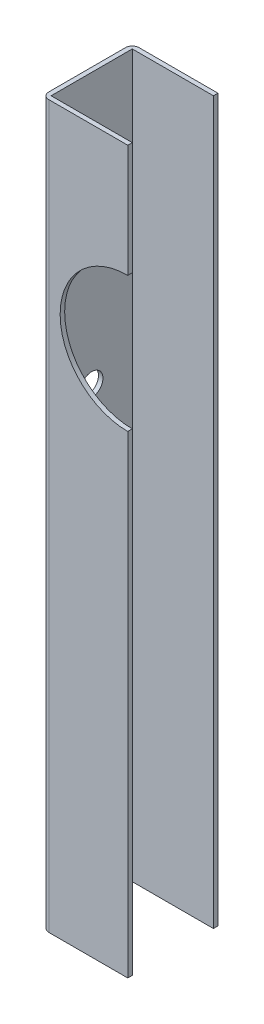
ISO-10303-21;
HEADER;
FILE_DESCRIPTION(('STEP AP214'),'2;1');
FILE_NAME('part.step','',(''),(''),'','','');
FILE_SCHEMA(('AUTOMOTIVE_DESIGN { 1 0 10303 214 1 1 1 1 }'));
ENDSEC;
DATA;
#1=APPLICATION_CONTEXT('core data for automotive mechanical design processes');
#2=APPLICATION_PROTOCOL_DEFINITION('international standard','automotive_design',2000,#1);
#3=PRODUCT_CONTEXT('',#1,'mechanical');
#4=PRODUCT('Part','Part','',(#3));
#5=PRODUCT_RELATED_PRODUCT_CATEGORY('part','',(#4));
#6=PRODUCT_DEFINITION_FORMATION('','',#4);
#7=PRODUCT_DEFINITION_CONTEXT('part definition',#1,'design');
#8=PRODUCT_DEFINITION('design','',#6,#7);
#9=PRODUCT_DEFINITION_SHAPE('','',#8);
#10=(LENGTH_UNIT() NAMED_UNIT(*) SI_UNIT(.MILLI.,.METRE.));
#11=(NAMED_UNIT(*) PLANE_ANGLE_UNIT() SI_UNIT($,.RADIAN.));
#12=(NAMED_UNIT(*) SI_UNIT($,.STERADIAN.) SOLID_ANGLE_UNIT());
#13=UNCERTAINTY_MEASURE_WITH_UNIT(LENGTH_MEASURE(1.E-05),#10,'distance_accuracy_value','');
#14=(GEOMETRIC_REPRESENTATION_CONTEXT(3) GLOBAL_UNCERTAINTY_ASSIGNED_CONTEXT((#13)) GLOBAL_UNIT_ASSIGNED_CONTEXT((#10,
#11,#12)) REPRESENTATION_CONTEXT('',''));
#15=CARTESIAN_POINT('',(0.,0.,0.));
#16=DIRECTION('',(0.,0.,1.));
#17=DIRECTION('',(1.,0.,0.));
#18=AXIS2_PLACEMENT_3D('',#15,#16,#17);
#19=CARTESIAN_POINT('',(11.43,203.2,11.43));
#20=DIRECTION('',(-1.,0.,0.));
#21=DIRECTION('',(0.,0.,1.));
#22=AXIS2_PLACEMENT_3D('',#19,#20,#21);
#23=PLANE('',#22);
#24=DIRECTION('',(0.,0.,-1.));
#25=VECTOR('',#24,1.);
#26=CARTESIAN_POINT('',(11.43,133.35,270.447626383348));
#27=LINE('',#26,#25);
#28=CARTESIAN_POINT('',(11.43,133.35,12.7));
#29=VERTEX_POINT('',#28);
#30=CARTESIAN_POINT('',(11.43,133.35,11.43));
#31=VERTEX_POINT('',#30);
#32=EDGE_CURVE('E149',#29,#31,#27,.T.);
#33=ORIENTED_EDGE('',*,*,#32,.F.);
#34=DIRECTION('',(0.,-1.,0.));
#35=VECTOR('',#34,1.);
#36=CARTESIAN_POINT('',(11.43,203.2,12.7));
#37=LINE('',#36,#35);
#38=CARTESIAN_POINT('',(11.43,0.,12.7));
#39=VERTEX_POINT('',#38);
#40=EDGE_CURVE('E157',#29,#39,#37,.T.);
#41=ORIENTED_EDGE('',*,*,#40,.T.);
#42=DIRECTION('',(0.,0.,-1.));
#43=VECTOR('',#42,1.);
#44=CARTESIAN_POINT('',(11.43,0.,12.7));
#45=LINE('',#44,#43);
#46=CARTESIAN_POINT('',(11.43,0.,11.43));
#47=VERTEX_POINT('',#46);
#48=EDGE_CURVE('E175',#39,#47,#45,.T.);
#49=ORIENTED_EDGE('',*,*,#48,.T.);
#50=DIRECTION('',(0.,-1.,0.));
#51=VECTOR('',#50,1.);
#52=CARTESIAN_POINT('',(11.43,203.2,11.43));
#53=LINE('',#52,#51);
#54=EDGE_CURVE('E193',#31,#47,#53,.T.);
#55=ORIENTED_EDGE('',*,*,#54,.F.);
#56=EDGE_LOOP('',(#33,#41,#49,#55));
#57=FACE_BOUND('',#56,.T.);
#58=ADVANCED_FACE('F45',(#57),#23,.F.);
#59=CARTESIAN_POINT('',(-12.7,203.2,12.7));
#60=DIRECTION('',(0.,0.,-1.));
#61=DIRECTION('',(-1.,0.,0.));
#62=AXIS2_PLACEMENT_3D('',#59,#60,#61);
#63=PLANE('',#62);
#64=DIRECTION('',(1.,0.,0.));
#65=VECTOR('',#64,1.);
#66=CARTESIAN_POINT('',(-12.7,203.2,12.7));
#67=LINE('',#66,#65);
#68=CARTESIAN_POINT('',(-10.795,203.2,12.7));
#69=VERTEX_POINT('',#68);
#70=CARTESIAN_POINT('',(11.43,203.2,12.7));
#71=VERTEX_POINT('',#70);
#72=EDGE_CURVE('E221',#69,#71,#67,.T.);
#73=ORIENTED_EDGE('',*,*,#72,.F.);
#74=DIRECTION('',(0.,-1.,0.));
#75=VECTOR('',#74,1.);
#76=CARTESIAN_POINT('',(-10.795,203.2,12.7));
#77=LINE('',#76,#75);
#78=CARTESIAN_POINT('',(-10.795,0.,12.7));
#79=VERTEX_POINT('',#78);
#80=EDGE_CURVE('E11',#69,#79,#77,.T.);
#81=ORIENTED_EDGE('',*,*,#80,.T.);
#82=DIRECTION('',(1.,0.,0.));
#83=VECTOR('',#82,1.);
#84=CARTESIAN_POINT('',(-12.7,0.,12.7));
#85=LINE('',#84,#83);
#86=EDGE_CURVE('E218',#79,#39,#85,.T.);
#87=ORIENTED_EDGE('',*,*,#86,.T.);
#88=ORIENTED_EDGE('',*,*,#40,.F.);
#89=CARTESIAN_POINT('',(11.43,152.4,12.7));
#90=DIRECTION('',(0.,0.,-1.));
#91=DIRECTION('',(-1.,0.,0.));
#92=AXIS2_PLACEMENT_3D('',#89,#90,#91);
#93=CIRCLE('',#92,19.05);
#94=CARTESIAN_POINT('',(11.43,171.45,12.7));
#95=VERTEX_POINT('',#94);
#96=EDGE_CURVE('E140',#29,#95,#93,.T.);
#97=ORIENTED_EDGE('',*,*,#96,.T.);
#98=EDGE_CURVE('E155',#71,#95,#37,.T.);
#99=ORIENTED_EDGE('',*,*,#98,.F.);
#100=EDGE_LOOP('',(#73,#81,#87,#88,#97,#99));
#101=FACE_BOUND('',#100,.T.);
#102=ADVANCED_FACE('F154',(#101),#63,.F.);
#103=CARTESIAN_POINT('',(0.,203.2,0.));
#104=DIRECTION('',(0.,-1.,0.));
#105=DIRECTION('',(0.,0.,-1.));
#106=AXIS2_PLACEMENT_3D('',#103,#104,#105);
#107=PLANE('',#106);
#108=DIRECTION('',(-1.,0.,0.));
#109=VECTOR('',#108,1.);
#110=CARTESIAN_POINT('',(-12.7,203.2,-12.7));
#111=LINE('',#110,#109);
#112=CARTESIAN_POINT('',(11.43,203.2,-12.7));
#113=VERTEX_POINT('',#112);
#114=CARTESIAN_POINT('',(-10.795,203.2,-12.7));
#115=VERTEX_POINT('',#114);
#116=EDGE_CURVE('E214',#113,#115,#111,.T.);
#117=ORIENTED_EDGE('',*,*,#116,.T.);
#118=CARTESIAN_POINT('',(-10.795,203.2,-10.795));
#119=DIRECTION('',(0.,-1.,0.));
#120=DIRECTION('',(0.,0.,-1.));
#121=AXIS2_PLACEMENT_3D('',#118,#119,#120);
#122=CIRCLE('',#121,1.905);
#123=CARTESIAN_POINT('',(-12.7,203.2,-10.795));
#124=VERTEX_POINT('',#123);
#125=EDGE_CURVE('E54',#115,#124,#122,.F.);
#126=ORIENTED_EDGE('',*,*,#125,.T.);
#127=DIRECTION('',(0.,0.,1.));
#128=VECTOR('',#127,1.);
#129=CARTESIAN_POINT('',(-12.7,203.2,12.7));
#130=LINE('',#129,#128);
#131=CARTESIAN_POINT('',(-12.7,203.2,10.795));
#132=VERTEX_POINT('',#131);
#133=EDGE_CURVE('E217',#124,#132,#130,.T.);
#134=ORIENTED_EDGE('',*,*,#133,.T.);
#135=CARTESIAN_POINT('',(-10.795,203.2,10.795));
#136=DIRECTION('',(0.,-1.,0.));
#137=DIRECTION('',(0.,0.,-1.));
#138=AXIS2_PLACEMENT_3D('',#135,#136,#137);
#139=CIRCLE('',#138,1.905);
#140=EDGE_CURVE('E61',#132,#69,#139,.F.);
#141=ORIENTED_EDGE('',*,*,#140,.T.);
#142=ORIENTED_EDGE('',*,*,#72,.T.);
#143=DIRECTION('',(0.,0.,1.));
#144=VECTOR('',#143,1.);
#145=CARTESIAN_POINT('',(11.43,203.2,12.7));
#146=LINE('',#145,#144);
#147=CARTESIAN_POINT('',(11.43,203.2,11.43));
#148=VERTEX_POINT('',#147);
#149=EDGE_CURVE('E163',#148,#71,#146,.T.);
#150=ORIENTED_EDGE('',*,*,#149,.F.);
#151=DIRECTION('',(1.,0.,0.));
#152=VECTOR('',#151,1.);
#153=CARTESIAN_POINT('',(-11.43,203.2,11.43));
#154=LINE('',#153,#152);
#155=CARTESIAN_POINT('',(-11.43,203.2,11.43));
#156=VERTEX_POINT('',#155);
#157=EDGE_CURVE('E190',#156,#148,#154,.T.);
#158=ORIENTED_EDGE('',*,*,#157,.F.);
#159=DIRECTION('',(0.,0.,1.));
#160=VECTOR('',#159,1.);
#161=CARTESIAN_POINT('',(-11.43,203.2,11.43));
#162=LINE('',#161,#160);
#163=CARTESIAN_POINT('',(-11.43,203.2,-11.43));
#164=VERTEX_POINT('',#163);
#165=EDGE_CURVE('E185',#164,#156,#162,.T.);
#166=ORIENTED_EDGE('',*,*,#165,.F.);
#167=DIRECTION('',(-1.,0.,0.));
#168=VECTOR('',#167,1.);
#169=CARTESIAN_POINT('',(-11.43,203.2,-11.43));
#170=LINE('',#169,#168);
#171=CARTESIAN_POINT('',(11.43,203.2,-11.43));
#172=VERTEX_POINT('',#171);
#173=EDGE_CURVE('E182',#172,#164,#170,.T.);
#174=ORIENTED_EDGE('',*,*,#173,.F.);
#175=EDGE_CURVE('E172',#113,#172,#146,.T.);
#176=ORIENTED_EDGE('',*,*,#175,.F.);
#177=EDGE_LOOP('',(#117,#126,#134,#141,#142,#150,#158,#166,#174,#176));
#178=FACE_BOUND('',#177,.T.);
#179=ADVANCED_FACE('F253',(#178),#107,.F.);
#180=CARTESIAN_POINT('',(0.,0.,0.));
#181=DIRECTION('',(0.,-1.,0.));
#182=DIRECTION('',(0.,0.,-1.));
#183=AXIS2_PLACEMENT_3D('',#180,#181,#182);
#184=PLANE('',#183);
#185=DIRECTION('',(0.,0.,1.));
#186=VECTOR('',#185,1.);
#187=CARTESIAN_POINT('',(-12.7,0.,12.7));
#188=LINE('',#187,#186);
#189=CARTESIAN_POINT('',(-12.7,0.,-10.795));
#190=VERTEX_POINT('',#189);
#191=CARTESIAN_POINT('',(-12.7,0.,10.795));
#192=VERTEX_POINT('',#191);
#193=EDGE_CURVE('E226',#190,#192,#188,.T.);
#194=ORIENTED_EDGE('',*,*,#193,.F.);
#195=CARTESIAN_POINT('',(-10.795,0.,-10.795));
#196=DIRECTION('',(0.,-1.,0.));
#197=DIRECTION('',(0.,0.,-1.));
#198=AXIS2_PLACEMENT_3D('',#195,#196,#197);
#199=CIRCLE('',#198,1.905);
#200=CARTESIAN_POINT('',(-10.795,0.,-12.7));
#201=VERTEX_POINT('',#200);
#202=EDGE_CURVE('E244',#190,#201,#199,.T.);
#203=ORIENTED_EDGE('',*,*,#202,.T.);
#204=DIRECTION('',(-1.,0.,0.));
#205=VECTOR('',#204,1.);
#206=CARTESIAN_POINT('',(-12.7,0.,-12.7));
#207=LINE('',#206,#205);
#208=CARTESIAN_POINT('',(11.43,0.,-12.7));
#209=VERTEX_POINT('',#208);
#210=EDGE_CURVE('E213',#209,#201,#207,.T.);
#211=ORIENTED_EDGE('',*,*,#210,.F.);
#212=CARTESIAN_POINT('',(11.43,0.,-11.43));
#213=VERTEX_POINT('',#212);
#214=EDGE_CURVE('E271',#213,#209,#45,.T.);
#215=ORIENTED_EDGE('',*,*,#214,.F.);
#216=DIRECTION('',(-1.,0.,0.));
#217=VECTOR('',#216,1.);
#218=CARTESIAN_POINT('',(-11.43,0.,-11.43));
#219=LINE('',#218,#217);
#220=CARTESIAN_POINT('',(-11.43,0.,-11.43));
#221=VERTEX_POINT('',#220);
#222=EDGE_CURVE('E165',#213,#221,#219,.T.);
#223=ORIENTED_EDGE('',*,*,#222,.T.);
#224=DIRECTION('',(0.,0.,1.));
#225=VECTOR('',#224,1.);
#226=CARTESIAN_POINT('',(-11.43,0.,11.43));
#227=LINE('',#226,#225);
#228=CARTESIAN_POINT('',(-11.43,0.,11.43));
#229=VERTEX_POINT('',#228);
#230=EDGE_CURVE('E170',#221,#229,#227,.T.);
#231=ORIENTED_EDGE('',*,*,#230,.T.);
#232=DIRECTION('',(1.,0.,0.));
#233=VECTOR('',#232,1.);
#234=CARTESIAN_POINT('',(-11.43,0.,11.43));
#235=LINE('',#234,#233);
#236=EDGE_CURVE('E186',#229,#47,#235,.T.);
#237=ORIENTED_EDGE('',*,*,#236,.T.);
#238=ORIENTED_EDGE('',*,*,#48,.F.);
#239=ORIENTED_EDGE('',*,*,#86,.F.);
#240=CARTESIAN_POINT('',(-10.795,0.,10.795));
#241=DIRECTION('',(0.,-1.,0.));
#242=DIRECTION('',(0.,0.,-1.));
#243=AXIS2_PLACEMENT_3D('',#240,#241,#242);
#244=CIRCLE('',#243,1.905);
#245=EDGE_CURVE('E241',#79,#192,#244,.T.);
#246=ORIENTED_EDGE('',*,*,#245,.T.);
#247=EDGE_LOOP('',(#194,#203,#211,#215,#223,#231,#237,#238,#239,#246));
#248=FACE_BOUND('',#247,.T.);
#249=ADVANCED_FACE('F264',(#248),#184,.T.);
#250=CARTESIAN_POINT('',(-12.7,203.2,-12.7));
#251=DIRECTION('',(0.,0.,1.));
#252=DIRECTION('',(1.,0.,0.));
#253=AXIS2_PLACEMENT_3D('',#250,#251,#252);
#254=PLANE('',#253);
#255=ORIENTED_EDGE('',*,*,#210,.T.);
#256=DIRECTION('',(0.,-1.,0.));
#257=VECTOR('',#256,1.);
#258=CARTESIAN_POINT('',(-10.795,203.2,-12.7));
#259=LINE('',#258,#257);
#260=EDGE_CURVE('E69',#201,#115,#259,.F.);
#261=ORIENTED_EDGE('',*,*,#260,.T.);
#262=ORIENTED_EDGE('',*,*,#116,.F.);
#263=DIRECTION('',(0.,1.,0.));
#264=VECTOR('',#263,1.);
#265=CARTESIAN_POINT('',(11.43,203.2,-12.7));
#266=LINE('',#265,#264);
#267=EDGE_CURVE('E179',#209,#113,#266,.T.);
#268=ORIENTED_EDGE('',*,*,#267,.F.);
#269=EDGE_LOOP('',(#255,#261,#262,#268));
#270=FACE_BOUND('',#269,.T.);
#271=ADVANCED_FACE('F267',(#270),#254,.F.);
#272=CARTESIAN_POINT('',(-12.7,203.2,12.7));
#273=DIRECTION('',(1.,0.,0.));
#274=DIRECTION('',(0.,0.,-1.));
#275=AXIS2_PLACEMENT_3D('',#272,#273,#274);
#276=PLANE('',#275);
#277=CARTESIAN_POINT('',(-12.7,25.4,0.));
#278=DIRECTION('',(-1.,0.,0.));
#279=DIRECTION('',(0.,0.,1.));
#280=AXIS2_PLACEMENT_3D('',#277,#278,#279);
#281=CIRCLE('',#280,3.175);
#282=CARTESIAN_POINT('',(-12.7,25.4,3.17499999999994));
#283=VERTEX_POINT('',#282);
#284=EDGE_CURVE('E289',#283,#283,#281,.T.);
#285=ORIENTED_EDGE('',*,*,#284,.F.);
#286=EDGE_LOOP('',(#285));
#287=FACE_BOUND('',#286,.T.);
#288=CARTESIAN_POINT('',(-12.7,76.2,-2.31502523850632E-13));
#289=DIRECTION('',(-1.,0.,0.));
#290=DIRECTION('',(0.,0.,1.));
#291=AXIS2_PLACEMENT_3D('',#288,#289,#290);
#292=CIRCLE('',#291,3.175);
#293=CARTESIAN_POINT('',(-12.7,76.2,3.17499999999977));
#294=VERTEX_POINT('',#293);
#295=EDGE_CURVE('E295',#294,#294,#292,.T.);
#296=ORIENTED_EDGE('',*,*,#295,.F.);
#297=EDGE_LOOP('',(#296));
#298=FACE_BOUND('',#297,.T.);
#299=CARTESIAN_POINT('',(-12.7,127.,-4.05759172994028E-13));
#300=DIRECTION('',(-1.,0.,0.));
#301=DIRECTION('',(0.,0.,1.));
#302=AXIS2_PLACEMENT_3D('',#299,#300,#301);
#303=CIRCLE('',#302,3.175);
#304=CARTESIAN_POINT('',(-12.7,127.,3.17499999999959));
#305=VERTEX_POINT('',#304);
#306=EDGE_CURVE('E302',#305,#305,#303,.T.);
#307=ORIENTED_EDGE('',*,*,#306,.F.);
#308=EDGE_LOOP('',(#307));
#309=FACE_BOUND('',#308,.T.);
#310=CARTESIAN_POINT('',(-12.7,177.8,-1.84382458139314E-13));
#311=DIRECTION('',(-1.,0.,0.));
#312=DIRECTION('',(0.,0.,1.));
#313=AXIS2_PLACEMENT_3D('',#310,#311,#312);
#314=CIRCLE('',#313,3.175);
#315=CARTESIAN_POINT('',(-12.7,177.8,3.17499999999981));
#316=VERTEX_POINT('',#315);
#317=EDGE_CURVE('E310',#316,#316,#314,.T.);
#318=ORIENTED_EDGE('',*,*,#317,.F.);
#319=EDGE_LOOP('',(#318));
#320=FACE_BOUND('',#319,.T.);
#321=ORIENTED_EDGE('',*,*,#133,.F.);
#322=DIRECTION('',(0.,-1.,0.));
#323=VECTOR('',#322,1.);
#324=CARTESIAN_POINT('',(-12.7,203.2,-10.795));
#325=LINE('',#324,#323);
#326=EDGE_CURVE('E237',#124,#190,#325,.T.);
#327=ORIENTED_EDGE('',*,*,#326,.T.);
#328=ORIENTED_EDGE('',*,*,#193,.T.);
#329=DIRECTION('',(0.,-1.,0.));
#330=VECTOR('',#329,1.);
#331=CARTESIAN_POINT('',(-12.7,203.2,10.795));
#332=LINE('',#331,#330);
#333=EDGE_CURVE('E234',#192,#132,#332,.F.);
#334=ORIENTED_EDGE('',*,*,#333,.T.);
#335=EDGE_LOOP('',(#321,#327,#328,#334));
#336=FACE_BOUND('',#335,.T.);
#337=ADVANCED_FACE('F258',(#287,#298,#309,#320,#336),#276,.F.);
#338=CARTESIAN_POINT('',(-11.43,203.2,-11.43));
#339=DIRECTION('',(0.,0.,1.));
#340=DIRECTION('',(1.,0.,0.));
#341=AXIS2_PLACEMENT_3D('',#338,#339,#340);
#342=PLANE('',#341);
#343=ORIENTED_EDGE('',*,*,#222,.F.);
#344=DIRECTION('',(0.,-1.,0.));
#345=VECTOR('',#344,1.);
#346=CARTESIAN_POINT('',(11.43,203.2,-11.43));
#347=LINE('',#346,#345);
#348=EDGE_CURVE('E210',#172,#213,#347,.T.);
#349=ORIENTED_EDGE('',*,*,#348,.F.);
#350=ORIENTED_EDGE('',*,*,#173,.T.);
#351=DIRECTION('',(0.,-1.,0.));
#352=VECTOR('',#351,1.);
#353=CARTESIAN_POINT('',(-11.43,203.2,-11.43));
#354=LINE('',#353,#352);
#355=EDGE_CURVE('E207',#164,#221,#354,.T.);
#356=ORIENTED_EDGE('',*,*,#355,.T.);
#357=EDGE_LOOP('',(#343,#349,#350,#356));
#358=FACE_BOUND('',#357,.T.);
#359=ADVANCED_FACE('F278',(#358),#342,.T.);
#360=CARTESIAN_POINT('',(-11.43,203.2,11.43));
#361=DIRECTION('',(1.,0.,0.));
#362=DIRECTION('',(0.,0.,-1.));
#363=AXIS2_PLACEMENT_3D('',#360,#361,#362);
#364=PLANE('',#363);
#365=CARTESIAN_POINT('',(-11.43,25.4,0.));
#366=DIRECTION('',(1.,0.,0.));
#367=DIRECTION('',(0.,0.,-1.));
#368=AXIS2_PLACEMENT_3D('',#365,#366,#367);
#369=CIRCLE('',#368,3.175);
#370=CARTESIAN_POINT('',(-11.43,25.4,-3.17500000000006));
#371=VERTEX_POINT('',#370);
#372=EDGE_CURVE('E284',#371,#371,#369,.F.);
#373=ORIENTED_EDGE('',*,*,#372,.T.);
#374=EDGE_LOOP('',(#373));
#375=FACE_BOUND('',#374,.T.);
#376=CARTESIAN_POINT('',(-11.43,76.2,-2.31502523850632E-13));
#377=DIRECTION('',(1.,0.,0.));
#378=DIRECTION('',(0.,0.,-1.));
#379=AXIS2_PLACEMENT_3D('',#376,#377,#378);
#380=CIRCLE('',#379,3.175);
#381=CARTESIAN_POINT('',(-11.43,76.2,-3.17500000000023));
#382=VERTEX_POINT('',#381);
#383=EDGE_CURVE('E298',#382,#382,#380,.F.);
#384=ORIENTED_EDGE('',*,*,#383,.T.);
#385=EDGE_LOOP('',(#384));
#386=FACE_BOUND('',#385,.T.);
#387=CARTESIAN_POINT('',(-11.43,127.,-4.05759172994028E-13));
#388=DIRECTION('',(1.,0.,0.));
#389=DIRECTION('',(0.,0.,-1.));
#390=AXIS2_PLACEMENT_3D('',#387,#388,#389);
#391=CIRCLE('',#390,3.175);
#392=CARTESIAN_POINT('',(-11.43,127.,-3.1750000000004));
#393=VERTEX_POINT('',#392);
#394=EDGE_CURVE('E306',#393,#393,#391,.F.);
#395=ORIENTED_EDGE('',*,*,#394,.T.);
#396=EDGE_LOOP('',(#395));
#397=FACE_BOUND('',#396,.T.);
#398=CARTESIAN_POINT('',(-11.43,177.8,-1.84382458139314E-13));
#399=DIRECTION('',(1.,0.,0.));
#400=DIRECTION('',(0.,0.,-1.));
#401=AXIS2_PLACEMENT_3D('',#398,#399,#400);
#402=CIRCLE('',#401,3.175);
#403=CARTESIAN_POINT('',(-11.43,177.8,-3.17500000000018));
#404=VERTEX_POINT('',#403);
#405=EDGE_CURVE('E148',#404,#404,#402,.F.);
#406=ORIENTED_EDGE('',*,*,#405,.T.);
#407=EDGE_LOOP('',(#406));
#408=FACE_BOUND('',#407,.T.);
#409=ORIENTED_EDGE('',*,*,#230,.F.);
#410=ORIENTED_EDGE('',*,*,#355,.F.);
#411=ORIENTED_EDGE('',*,*,#165,.T.);
#412=DIRECTION('',(0.,-1.,0.));
#413=VECTOR('',#412,1.);
#414=CARTESIAN_POINT('',(-11.43,203.2,11.43));
#415=LINE('',#414,#413);
#416=EDGE_CURVE('E204',#156,#229,#415,.T.);
#417=ORIENTED_EDGE('',*,*,#416,.T.);
#418=EDGE_LOOP('',(#409,#410,#411,#417));
#419=FACE_BOUND('',#418,.T.);
#420=ADVANCED_FACE('F281',(#375,#386,#397,#408,#419),#364,.T.);
#421=CARTESIAN_POINT('',(-11.43,203.2,11.43));
#422=DIRECTION('',(0.,0.,-1.));
#423=DIRECTION('',(-1.,0.,0.));
#424=AXIS2_PLACEMENT_3D('',#421,#422,#423);
#425=PLANE('',#424);
#426=CARTESIAN_POINT('',(11.43,171.45,11.43));
#427=VERTEX_POINT('',#426);
#428=EDGE_CURVE('E201',#148,#427,#53,.T.);
#429=ORIENTED_EDGE('',*,*,#428,.T.);
#430=CARTESIAN_POINT('',(11.43,152.4,11.43));
#431=DIRECTION('',(0.,0.,-1.));
#432=DIRECTION('',(-1.,0.,0.));
#433=AXIS2_PLACEMENT_3D('',#430,#431,#432);
#434=CIRCLE('',#433,19.05);
#435=EDGE_CURVE('E143',#427,#31,#434,.F.);
#436=ORIENTED_EDGE('',*,*,#435,.T.);
#437=ORIENTED_EDGE('',*,*,#54,.T.);
#438=ORIENTED_EDGE('',*,*,#236,.F.);
#439=ORIENTED_EDGE('',*,*,#416,.F.);
#440=ORIENTED_EDGE('',*,*,#157,.T.);
#441=EDGE_LOOP('',(#429,#436,#437,#438,#439,#440));
#442=FACE_BOUND('',#441,.T.);
#443=ADVANCED_FACE('F348',(#442),#425,.T.);
#444=ORIENTED_EDGE('',*,*,#98,.T.);
#445=DIRECTION('',(0.,0.,-1.));
#446=VECTOR('',#445,1.);
#447=CARTESIAN_POINT('',(11.43,171.45,270.447626383348));
#448=LINE('',#447,#446);
#449=EDGE_CURVE('E137',#95,#427,#448,.T.);
#450=ORIENTED_EDGE('',*,*,#449,.T.);
#451=ORIENTED_EDGE('',*,*,#428,.F.);
#452=ORIENTED_EDGE('',*,*,#149,.T.);
#453=EDGE_LOOP('',(#444,#450,#451,#452));
#454=FACE_BOUND('',#453,.T.);
#455=ADVANCED_FACE('F161',(#454),#23,.F.);
#456=ORIENTED_EDGE('',*,*,#348,.T.);
#457=ORIENTED_EDGE('',*,*,#214,.T.);
#458=ORIENTED_EDGE('',*,*,#267,.T.);
#459=ORIENTED_EDGE('',*,*,#175,.T.);
#460=EDGE_LOOP('',(#456,#457,#458,#459));
#461=FACE_BOUND('',#460,.T.);
#462=ADVANCED_FACE('F269',(#461),#23,.F.);
#463=CARTESIAN_POINT('',(-2.44974387893084,177.8,-1.84382458139314E-13));
#464=DIRECTION('',(-1.,0.,0.));
#465=DIRECTION('',(0.,0.,1.));
#466=AXIS2_PLACEMENT_3D('',#463,#464,#465);
#467=CYLINDRICAL_SURFACE('',#466,3.175);
#468=ORIENTED_EDGE('',*,*,#317,.T.);
#469=EDGE_LOOP('',(#468));
#470=FACE_BOUND('',#469,.T.);
#471=ORIENTED_EDGE('',*,*,#405,.F.);
#472=EDGE_LOOP('',(#471));
#473=FACE_BOUND('',#472,.T.);
#474=ADVANCED_FACE('F320',(#470,#473),#467,.F.);
#475=CARTESIAN_POINT('',(-2.44974387893084,127.,-4.05759172994028E-13));
#476=DIRECTION('',(-1.,0.,0.));
#477=DIRECTION('',(0.,0.,1.));
#478=AXIS2_PLACEMENT_3D('',#475,#476,#477);
#479=CYLINDRICAL_SURFACE('',#478,3.175);
#480=ORIENTED_EDGE('',*,*,#306,.T.);
#481=EDGE_LOOP('',(#480));
#482=FACE_BOUND('',#481,.T.);
#483=ORIENTED_EDGE('',*,*,#394,.F.);
#484=EDGE_LOOP('',(#483));
#485=FACE_BOUND('',#484,.T.);
#486=ADVANCED_FACE('F410',(#482,#485),#479,.F.);
#487=CARTESIAN_POINT('',(-2.44974387893084,76.2,-2.31502523850632E-13));
#488=DIRECTION('',(-1.,0.,0.));
#489=DIRECTION('',(0.,0.,1.));
#490=AXIS2_PLACEMENT_3D('',#487,#488,#489);
#491=CYLINDRICAL_SURFACE('',#490,3.175);
#492=ORIENTED_EDGE('',*,*,#295,.T.);
#493=EDGE_LOOP('',(#492));
#494=FACE_BOUND('',#493,.T.);
#495=ORIENTED_EDGE('',*,*,#383,.F.);
#496=EDGE_LOOP('',(#495));
#497=FACE_BOUND('',#496,.T.);
#498=ADVANCED_FACE('F418',(#494,#497),#491,.F.);
#499=CARTESIAN_POINT('',(-2.44974387893084,25.4,0.));
#500=DIRECTION('',(-1.,0.,0.));
#501=DIRECTION('',(0.,0.,1.));
#502=AXIS2_PLACEMENT_3D('',#499,#500,#501);
#503=CYLINDRICAL_SURFACE('',#502,3.175);
#504=ORIENTED_EDGE('',*,*,#284,.T.);
#505=EDGE_LOOP('',(#504));
#506=FACE_BOUND('',#505,.T.);
#507=ORIENTED_EDGE('',*,*,#372,.F.);
#508=EDGE_LOOP('',(#507));
#509=FACE_BOUND('',#508,.T.);
#510=ADVANCED_FACE('F428',(#506,#509),#503,.F.);
#511=CARTESIAN_POINT('',(11.43,152.4,270.447626383348));
#512=DIRECTION('',(0.,0.,-1.));
#513=DIRECTION('',(-1.,0.,0.));
#514=AXIS2_PLACEMENT_3D('',#511,#512,#513);
#515=CYLINDRICAL_SURFACE('',#514,19.05);
#516=ORIENTED_EDGE('',*,*,#435,.F.);
#517=ORIENTED_EDGE('',*,*,#449,.F.);
#518=ORIENTED_EDGE('',*,*,#96,.F.);
#519=ORIENTED_EDGE('',*,*,#32,.T.);
#520=EDGE_LOOP('',(#516,#517,#518,#519));
#521=FACE_BOUND('',#520,.T.);
#522=ADVANCED_FACE('F139',(#521),#515,.F.);
#523=CARTESIAN_POINT('',(-10.795,203.2,-10.795));
#524=DIRECTION('',(0.,-1.,0.));
#525=DIRECTION('',(0.,0.,-1.));
#526=AXIS2_PLACEMENT_3D('',#523,#524,#525);
#527=CYLINDRICAL_SURFACE('',#526,1.905);
#528=ORIENTED_EDGE('',*,*,#125,.F.);
#529=ORIENTED_EDGE('',*,*,#260,.F.);
#530=ORIENTED_EDGE('',*,*,#202,.F.);
#531=ORIENTED_EDGE('',*,*,#326,.F.);
#532=EDGE_LOOP('',(#528,#529,#530,#531));
#533=FACE_BOUND('',#532,.T.);
#534=ADVANCED_FACE('F261',(#533),#527,.T.);
#535=CARTESIAN_POINT('',(-10.795,203.2,10.795));
#536=DIRECTION('',(0.,-1.,0.));
#537=DIRECTION('',(0.,0.,-1.));
#538=AXIS2_PLACEMENT_3D('',#535,#536,#537);
#539=CYLINDRICAL_SURFACE('',#538,1.905);
#540=ORIENTED_EDGE('',*,*,#140,.F.);
#541=ORIENTED_EDGE('',*,*,#333,.F.);
#542=ORIENTED_EDGE('',*,*,#245,.F.);
#543=ORIENTED_EDGE('',*,*,#80,.F.);
#544=EDGE_LOOP('',(#540,#541,#542,#543));
#545=FACE_BOUND('',#544,.T.);
#546=ADVANCED_FACE('F47',(#545),#539,.T.);
#547=CLOSED_SHELL('',(#58,#102,#179,#249,#271,#337,#359,#420,#443,#455,#462,#474,#486,#498,#510,
#522,#534,#546));
#548=MANIFOLD_SOLID_BREP('B2',#547);
#549=ADVANCED_BREP_SHAPE_REPRESENTATION('',(#18,#548),#14);
#550=SHAPE_DEFINITION_REPRESENTATION(#9,#549);
ENDSEC;
END-ISO-10303-21;
